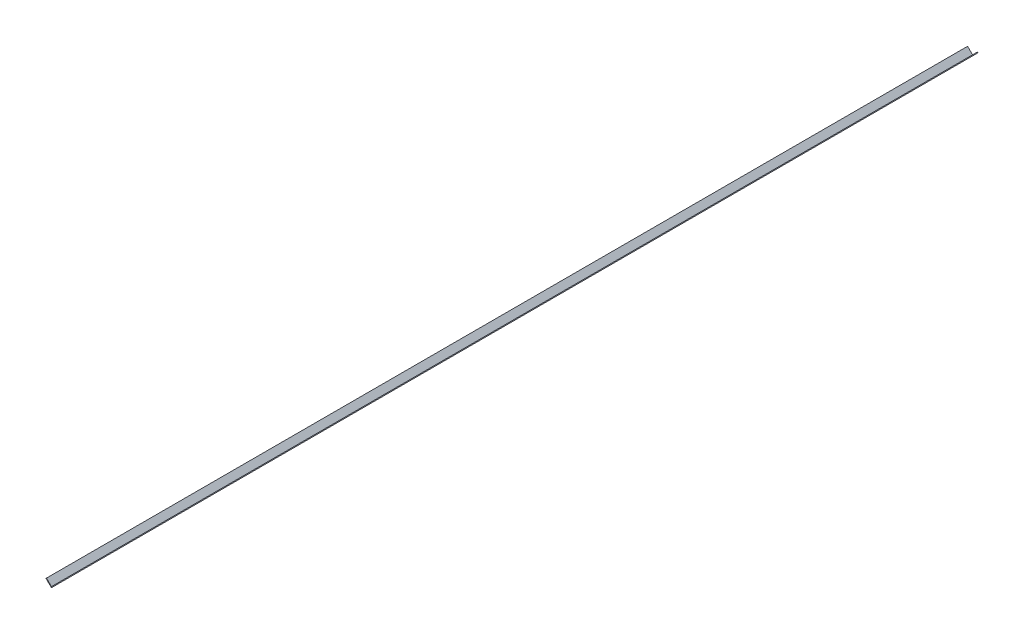
ISO-10303-21;
HEADER;
FILE_DESCRIPTION(('STEP AP214'),'2;1');
FILE_NAME('part.step','',(''),(''),'','','');
FILE_SCHEMA(('AUTOMOTIVE_DESIGN { 1 0 10303 214 1 1 1 1 }'));
ENDSEC;
DATA;
#1=APPLICATION_CONTEXT('core data for automotive mechanical design processes');
#2=APPLICATION_PROTOCOL_DEFINITION('international standard','automotive_design',2000,#1);
#3=PRODUCT_CONTEXT('',#1,'mechanical');
#4=PRODUCT('Part','Part','',(#3));
#5=PRODUCT_RELATED_PRODUCT_CATEGORY('part','',(#4));
#6=PRODUCT_DEFINITION_FORMATION('','',#4);
#7=PRODUCT_DEFINITION_CONTEXT('part definition',#1,'design');
#8=PRODUCT_DEFINITION('design','',#6,#7);
#9=PRODUCT_DEFINITION_SHAPE('','',#8);
#10=(LENGTH_UNIT() NAMED_UNIT(*) SI_UNIT(.MILLI.,.METRE.));
#11=(NAMED_UNIT(*) PLANE_ANGLE_UNIT() SI_UNIT($,.RADIAN.));
#12=(NAMED_UNIT(*) SI_UNIT($,.STERADIAN.) SOLID_ANGLE_UNIT());
#13=UNCERTAINTY_MEASURE_WITH_UNIT(LENGTH_MEASURE(1.E-05),#10,'distance_accuracy_value','');
#14=(GEOMETRIC_REPRESENTATION_CONTEXT(3) GLOBAL_UNCERTAINTY_ASSIGNED_CONTEXT((#13)) GLOBAL_UNIT_ASSIGNED_CONTEXT((#10,
#11,#12)) REPRESENTATION_CONTEXT('',''));
#15=CARTESIAN_POINT('',(0.,0.,0.));
#16=DIRECTION('',(0.,0.,1.));
#17=DIRECTION('',(1.,0.,0.));
#18=AXIS2_PLACEMENT_3D('',#15,#16,#17);
#19=CARTESIAN_POINT('',(8.98025612106916,8.98025612106915,-76.2));
#20=DIRECTION('',(-0.707106781186547,0.707106781186548,0.));
#21=DIRECTION('',(-0.707106781186548,-0.707106781186547,0.));
#22=AXIS2_PLACEMENT_3D('',#19,#20,#21);
#23=PLANE('',#22);
#24=DIRECTION('',(0.,0.,1.));
#25=VECTOR('',#24,1.);
#26=CARTESIAN_POINT('',(0.,0.,-76.2));
#27=LINE('',#26,#25);
#28=CARTESIAN_POINT('',(0.,0.,-76.2));
#29=VERTEX_POINT('',#28);
#30=CARTESIAN_POINT('',(0.,0.,1600.2));
#31=VERTEX_POINT('',#30);
#32=EDGE_CURVE('E42',#29,#31,#27,.T.);
#33=ORIENTED_EDGE('',*,*,#32,.T.);
#34=DIRECTION('',(-0.707106781186548,-0.707106781186547,0.));
#35=VECTOR('',#34,1.);
#36=CARTESIAN_POINT('',(8.98025612106916,8.98025612106915,1600.2));
#37=LINE('',#36,#35);
#38=CARTESIAN_POINT('',(8.98025612106916,8.98025612106915,1600.2));
#39=VERTEX_POINT('',#38);
#40=EDGE_CURVE('E92',#39,#31,#37,.T.);
#41=ORIENTED_EDGE('',*,*,#40,.F.);
#42=DIRECTION('',(0.,0.,1.));
#43=VECTOR('',#42,1.);
#44=CARTESIAN_POINT('',(8.98025612106916,8.98025612106915,-76.2));
#45=LINE('',#44,#43);
#46=CARTESIAN_POINT('',(8.98025612106916,8.98025612106915,-76.2));
#47=VERTEX_POINT('',#46);
#48=EDGE_CURVE('E11',#47,#39,#45,.T.);
#49=ORIENTED_EDGE('',*,*,#48,.F.);
#50=DIRECTION('',(-0.707106781186548,-0.707106781186547,0.));
#51=VECTOR('',#50,1.);
#52=CARTESIAN_POINT('',(8.98025612106916,8.98025612106915,-76.2));
#53=LINE('',#52,#51);
#54=EDGE_CURVE('E93',#47,#29,#53,.T.);
#55=ORIENTED_EDGE('',*,*,#54,.T.);
#56=EDGE_LOOP('',(#33,#41,#49,#55));
#57=FACE_BOUND('',#56,.T.);
#58=ADVANCED_FACE('F39',(#57),#23,.T.);
#59=CARTESIAN_POINT('',(9.87828173317607,8.08223050896223,-76.2));
#60=DIRECTION('',(0.707106781186548,0.707106781186547,0.));
#61=DIRECTION('',(-0.707106781186547,0.707106781186548,0.));
#62=AXIS2_PLACEMENT_3D('',#59,#60,#61);
#63=PLANE('',#62);
#64=ORIENTED_EDGE('',*,*,#48,.T.);
#65=DIRECTION('',(-0.707106781186547,0.707106781186548,0.));
#66=VECTOR('',#65,1.);
#67=CARTESIAN_POINT('',(9.87828173317607,8.08223050896223,1600.2));
#68=LINE('',#67,#66);
#69=CARTESIAN_POINT('',(9.87828173317607,8.08223050896223,1600.2));
#70=VERTEX_POINT('',#69);
#71=EDGE_CURVE('E112',#70,#39,#68,.T.);
#72=ORIENTED_EDGE('',*,*,#71,.F.);
#73=DIRECTION('',(0.,0.,1.));
#74=VECTOR('',#73,1.);
#75=CARTESIAN_POINT('',(9.87828173317607,8.08223050896223,-76.2));
#76=LINE('',#75,#74);
#77=CARTESIAN_POINT('',(9.87828173317607,8.08223050896223,-76.2));
#78=VERTEX_POINT('',#77);
#79=EDGE_CURVE('E48',#78,#70,#76,.T.);
#80=ORIENTED_EDGE('',*,*,#79,.F.);
#81=DIRECTION('',(-0.707106781186547,0.707106781186548,0.));
#82=VECTOR('',#81,1.);
#83=CARTESIAN_POINT('',(9.87828173317607,8.08223050896223,-76.2));
#84=LINE('',#83,#82);
#85=EDGE_CURVE('E99',#78,#47,#84,.T.);
#86=ORIENTED_EDGE('',*,*,#85,.T.);
#87=EDGE_LOOP('',(#64,#72,#80,#86));
#88=FACE_BOUND('',#87,.T.);
#89=ADVANCED_FACE('F167',(#88),#63,.T.);
#90=CARTESIAN_POINT('',(0.,-1.79605122421383,-76.2));
#91=DIRECTION('',(0.707106781186547,-0.707106781186548,0.));
#92=DIRECTION('',(0.707106781186548,0.707106781186547,0.));
#93=AXIS2_PLACEMENT_3D('',#90,#91,#92);
#94=PLANE('',#93);
#95=ORIENTED_EDGE('',*,*,#79,.T.);
#96=DIRECTION('',(0.707106781186548,0.707106781186547,0.));
#97=VECTOR('',#96,1.);
#98=CARTESIAN_POINT('',(0.,-1.79605122421383,1600.2));
#99=LINE('',#98,#97);
#100=CARTESIAN_POINT('',(0.,-1.79605122421383,1600.2));
#101=VERTEX_POINT('',#100);
#102=EDGE_CURVE('E122',#101,#70,#99,.T.);
#103=ORIENTED_EDGE('',*,*,#102,.F.);
#104=DIRECTION('',(0.,0.,1.));
#105=VECTOR('',#104,1.);
#106=CARTESIAN_POINT('',(0.,-1.79605122421383,-76.2));
#107=LINE('',#106,#105);
#108=CARTESIAN_POINT('',(0.,-1.79605122421383,-76.2));
#109=VERTEX_POINT('',#108);
#110=EDGE_CURVE('E147',#109,#101,#107,.T.);
#111=ORIENTED_EDGE('',*,*,#110,.F.);
#112=DIRECTION('',(0.707106781186548,0.707106781186547,0.));
#113=VECTOR('',#112,1.);
#114=CARTESIAN_POINT('',(0.,-1.79605122421383,-76.2));
#115=LINE('',#114,#113);
#116=EDGE_CURVE('E140',#109,#78,#115,.T.);
#117=ORIENTED_EDGE('',*,*,#116,.T.);
#118=EDGE_LOOP('',(#95,#103,#111,#117));
#119=FACE_BOUND('',#118,.T.);
#120=ADVANCED_FACE('F163',(#119),#94,.T.);
#121=CARTESIAN_POINT('',(-9.87828173317606,8.08223050896225,-76.2));
#122=DIRECTION('',(-0.707106781186548,-0.707106781186547,0.));
#123=DIRECTION('',(0.707106781186547,-0.707106781186548,0.));
#124=AXIS2_PLACEMENT_3D('',#121,#122,#123);
#125=PLANE('',#124);
#126=ORIENTED_EDGE('',*,*,#110,.T.);
#127=DIRECTION('',(0.707106781186547,-0.707106781186548,0.));
#128=VECTOR('',#127,1.);
#129=CARTESIAN_POINT('',(-9.87828173317606,8.08223050896225,1600.2));
#130=LINE('',#129,#128);
#131=CARTESIAN_POINT('',(-9.87828173317606,8.08223050896225,1600.2));
#132=VERTEX_POINT('',#131);
#133=EDGE_CURVE('E118',#132,#101,#130,.T.);
#134=ORIENTED_EDGE('',*,*,#133,.F.);
#135=DIRECTION('',(0.,0.,1.));
#136=VECTOR('',#135,1.);
#137=CARTESIAN_POINT('',(-9.87828173317606,8.08223050896225,-76.2));
#138=LINE('',#137,#136);
#139=CARTESIAN_POINT('',(-9.87828173317606,8.08223050896225,-76.2));
#140=VERTEX_POINT('',#139);
#141=EDGE_CURVE('E150',#140,#132,#138,.T.);
#142=ORIENTED_EDGE('',*,*,#141,.F.);
#143=DIRECTION('',(0.707106781186547,-0.707106781186548,0.));
#144=VECTOR('',#143,1.);
#145=CARTESIAN_POINT('',(-9.87828173317606,8.08223050896225,-76.2));
#146=LINE('',#145,#144);
#147=EDGE_CURVE('E136',#140,#109,#146,.T.);
#148=ORIENTED_EDGE('',*,*,#147,.T.);
#149=EDGE_LOOP('',(#126,#134,#142,#148));
#150=FACE_BOUND('',#149,.T.);
#151=ADVANCED_FACE('F160',(#150),#125,.T.);
#152=CARTESIAN_POINT('',(-8.98025612106914,8.98025612106916,-76.2));
#153=DIRECTION('',(-0.707106781186547,0.707106781186548,0.));
#154=DIRECTION('',(-0.707106781186548,-0.707106781186547,0.));
#155=AXIS2_PLACEMENT_3D('',#152,#153,#154);
#156=PLANE('',#155);
#157=ORIENTED_EDGE('',*,*,#141,.T.);
#158=DIRECTION('',(-0.707106781186548,-0.707106781186547,0.));
#159=VECTOR('',#158,1.);
#160=CARTESIAN_POINT('',(-8.98025612106914,8.98025612106916,1600.2));
#161=LINE('',#160,#159);
#162=CARTESIAN_POINT('',(-8.98025612106914,8.98025612106916,1600.2));
#163=VERTEX_POINT('',#162);
#164=EDGE_CURVE('E107',#163,#132,#161,.T.);
#165=ORIENTED_EDGE('',*,*,#164,.F.);
#166=DIRECTION('',(0.,0.,1.));
#167=VECTOR('',#166,1.);
#168=CARTESIAN_POINT('',(-8.98025612106914,8.98025612106916,-76.2));
#169=LINE('',#168,#167);
#170=CARTESIAN_POINT('',(-8.98025612106914,8.98025612106916,-76.2));
#171=VERTEX_POINT('',#170);
#172=EDGE_CURVE('E98',#171,#163,#169,.T.);
#173=ORIENTED_EDGE('',*,*,#172,.F.);
#174=DIRECTION('',(-0.707106781186548,-0.707106781186547,0.));
#175=VECTOR('',#174,1.);
#176=CARTESIAN_POINT('',(-8.98025612106914,8.98025612106916,-76.2));
#177=LINE('',#176,#175);
#178=EDGE_CURVE('E132',#171,#140,#177,.T.);
#179=ORIENTED_EDGE('',*,*,#178,.T.);
#180=EDGE_LOOP('',(#157,#165,#173,#179));
#181=FACE_BOUND('',#180,.T.);
#182=ADVANCED_FACE('F154',(#181),#156,.T.);
#183=CARTESIAN_POINT('',(0.,0.,-76.2));
#184=DIRECTION('',(0.707106781186548,0.707106781186547,0.));
#185=DIRECTION('',(-0.707106781186547,0.707106781186548,0.));
#186=AXIS2_PLACEMENT_3D('',#183,#184,#185);
#187=PLANE('',#186);
#188=ORIENTED_EDGE('',*,*,#172,.T.);
#189=DIRECTION('',(-0.707106781186547,0.707106781186548,0.));
#190=VECTOR('',#189,1.);
#191=CARTESIAN_POINT('',(0.,0.,1600.2));
#192=LINE('',#191,#190);
#193=EDGE_CURVE('E101',#31,#163,#192,.T.);
#194=ORIENTED_EDGE('',*,*,#193,.F.);
#195=ORIENTED_EDGE('',*,*,#32,.F.);
#196=DIRECTION('',(-0.707106781186547,0.707106781186548,0.));
#197=VECTOR('',#196,1.);
#198=CARTESIAN_POINT('',(0.,0.,-76.2));
#199=LINE('',#198,#197);
#200=EDGE_CURVE('E129',#29,#171,#199,.T.);
#201=ORIENTED_EDGE('',*,*,#200,.T.);
#202=EDGE_LOOP('',(#188,#194,#195,#201));
#203=FACE_BOUND('',#202,.T.);
#204=ADVANCED_FACE('F102',(#203),#187,.T.);
#205=CARTESIAN_POINT('',(0.,0.,-76.2));
#206=DIRECTION('',(0.,0.,-1.));
#207=DIRECTION('',(-1.,0.,0.));
#208=AXIS2_PLACEMENT_3D('',#205,#206,#207);
#209=PLANE('',#208);
#210=ORIENTED_EDGE('',*,*,#54,.F.);
#211=ORIENTED_EDGE('',*,*,#85,.F.);
#212=ORIENTED_EDGE('',*,*,#116,.F.);
#213=ORIENTED_EDGE('',*,*,#147,.F.);
#214=ORIENTED_EDGE('',*,*,#178,.F.);
#215=ORIENTED_EDGE('',*,*,#200,.F.);
#216=EDGE_LOOP('',(#210,#211,#212,#213,#214,#215));
#217=FACE_BOUND('',#216,.T.);
#218=ADVANCED_FACE('F166',(#217),#209,.T.);
#219=CARTESIAN_POINT('',(0.,0.,1600.2));
#220=DIRECTION('',(0.,0.,-1.));
#221=DIRECTION('',(-1.,0.,0.));
#222=AXIS2_PLACEMENT_3D('',#219,#220,#221);
#223=PLANE('',#222);
#224=ORIENTED_EDGE('',*,*,#40,.T.);
#225=ORIENTED_EDGE('',*,*,#193,.T.);
#226=ORIENTED_EDGE('',*,*,#164,.T.);
#227=ORIENTED_EDGE('',*,*,#133,.T.);
#228=ORIENTED_EDGE('',*,*,#102,.T.);
#229=ORIENTED_EDGE('',*,*,#71,.T.);
#230=EDGE_LOOP('',(#224,#225,#226,#227,#228,#229));
#231=FACE_BOUND('',#230,.T.);
#232=ADVANCED_FACE('F110',(#231),#223,.F.);
#233=CLOSED_SHELL('',(#58,#89,#120,#151,#182,#204,#218,#232));
#234=MANIFOLD_SOLID_BREP('B2',#233);
#235=ADVANCED_BREP_SHAPE_REPRESENTATION('',(#18,#234),#14);
#236=SHAPE_DEFINITION_REPRESENTATION(#9,#235);
ENDSEC;
END-ISO-10303-21;
